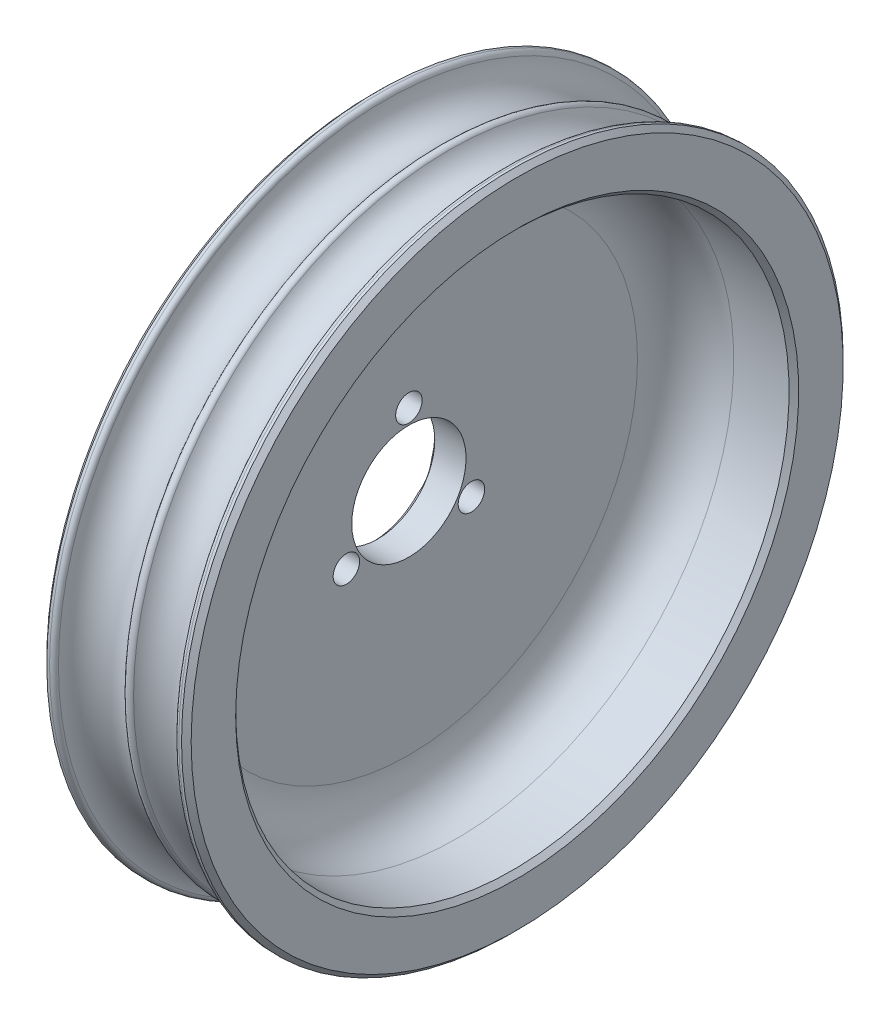
ISO-10303-21;
HEADER;
FILE_DESCRIPTION(('STEP AP214'),'2;1');
FILE_NAME('part.step','',(''),(''),'','','');
FILE_SCHEMA(('AUTOMOTIVE_DESIGN { 1 0 10303 214 1 1 1 1 }'));
ENDSEC;
DATA;
#1=APPLICATION_CONTEXT('core data for automotive mechanical design processes');
#2=APPLICATION_PROTOCOL_DEFINITION('international standard','automotive_design',2000,#1);
#3=PRODUCT_CONTEXT('',#1,'mechanical');
#4=PRODUCT('Part','Part','',(#3));
#5=PRODUCT_RELATED_PRODUCT_CATEGORY('part','',(#4));
#6=PRODUCT_DEFINITION_FORMATION('','',#4);
#7=PRODUCT_DEFINITION_CONTEXT('part definition',#1,'design');
#8=PRODUCT_DEFINITION('design','',#6,#7);
#9=PRODUCT_DEFINITION_SHAPE('','',#8);
#10=(LENGTH_UNIT() NAMED_UNIT(*) SI_UNIT(.MILLI.,.METRE.));
#11=(NAMED_UNIT(*) PLANE_ANGLE_UNIT() SI_UNIT($,.RADIAN.));
#12=(NAMED_UNIT(*) SI_UNIT($,.STERADIAN.) SOLID_ANGLE_UNIT());
#13=UNCERTAINTY_MEASURE_WITH_UNIT(LENGTH_MEASURE(1.E-05),#10,'distance_accuracy_value','');
#14=(GEOMETRIC_REPRESENTATION_CONTEXT(3) GLOBAL_UNCERTAINTY_ASSIGNED_CONTEXT((#13)) GLOBAL_UNIT_ASSIGNED_CONTEXT((#10,
#11,#12)) REPRESENTATION_CONTEXT('',''));
#15=CARTESIAN_POINT('',(0.,0.,0.));
#16=DIRECTION('',(0.,0.,1.));
#17=DIRECTION('',(1.,0.,0.));
#18=AXIS2_PLACEMENT_3D('',#15,#16,#17);
#19=CARTESIAN_POINT('',(-16.5806488145554,0.,0.));
#20=DIRECTION('',(-1.,0.,0.));
#21=DIRECTION('',(0.,0.,1.));
#22=AXIS2_PLACEMENT_3D('',#19,#20,#21);
#23=CYLINDRICAL_SURFACE('',#22,23.);
#24=CARTESIAN_POINT('',(1.,0.,0.));
#25=DIRECTION('',(-1.,0.,0.));
#26=DIRECTION('',(0.,0.,1.));
#27=AXIS2_PLACEMENT_3D('',#24,#25,#26);
#28=CIRCLE('',#27,23.);
#29=CARTESIAN_POINT('',(1.,0.,23.));
#30=VERTEX_POINT('',#29);
#31=EDGE_CURVE('E11',#30,#30,#28,.T.);
#32=ORIENTED_EDGE('',*,*,#31,.T.);
#33=EDGE_LOOP('',(#32));
#34=FACE_BOUND('',#33,.T.);
#35=CARTESIAN_POINT('',(5.60000000000001,0.,0.));
#36=DIRECTION('',(-1.,0.,0.));
#37=DIRECTION('',(0.,0.,1.));
#38=AXIS2_PLACEMENT_3D('',#35,#36,#37);
#39=CIRCLE('',#38,23.);
#40=CARTESIAN_POINT('',(5.60000000000001,0.,23.));
#41=VERTEX_POINT('',#40);
#42=EDGE_CURVE('E226',#41,#41,#39,.F.);
#43=ORIENTED_EDGE('',*,*,#42,.T.);
#44=EDGE_LOOP('',(#43));
#45=FACE_BOUND('',#44,.T.);
#46=ADVANCED_FACE('F35',(#34,#45),#23,.F.);
#47=CARTESIAN_POINT('',(2.5,0.,0.));
#48=DIRECTION('',(-1.,0.,0.));
#49=DIRECTION('',(0.,0.,1.));
#50=AXIS2_PLACEMENT_3D('',#47,#48,#49);
#51=TOROIDAL_SURFACE('',#50,27.5,2.5);
#52=CARTESIAN_POINT('',(4.97610458902581,0.,0.));
#53=DIRECTION('',(-1.,0.,0.));
#54=DIRECTION('',(0.,0.,1.));
#55=AXIS2_PLACEMENT_3D('',#52,#53,#54);
#56=CIRCLE('',#55,27.155172413793);
#57=CARTESIAN_POINT('',(4.97610458902581,0.,27.155172413793));
#58=VERTEX_POINT('',#57);
#59=EDGE_CURVE('E238',#58,#58,#56,.T.);
#60=ORIENTED_EDGE('',*,*,#59,.T.);
#61=EDGE_LOOP('',(#60));
#62=FACE_BOUND('',#61,.T.);
#63=CARTESIAN_POINT('',(0.344827586206885,0.,0.));
#64=DIRECTION('',(1.,0.,0.));
#65=DIRECTION('',(0.,0.,-1.));
#66=AXIS2_PLACEMENT_3D('',#63,#64,#65);
#67=CIRCLE('',#66,26.2330225468363);
#68=CARTESIAN_POINT('',(0.344827586206885,0.,-26.2330225468363));
#69=VERTEX_POINT('',#68);
#70=EDGE_CURVE('E241',#69,#69,#67,.T.);
#71=ORIENTED_EDGE('',*,*,#70,.T.);
#72=EDGE_LOOP('',(#71));
#73=FACE_BOUND('',#72,.T.);
#74=ADVANCED_FACE('F141',(#62,#73),#51,.F.);
#75=CARTESIAN_POINT('',(-2.5,0.,0.));
#76=DIRECTION('',(-1.,0.,0.));
#77=DIRECTION('',(0.,0.,1.));
#78=AXIS2_PLACEMENT_3D('',#75,#76,#77);
#79=TOROIDAL_SURFACE('',#78,27.5,2.5);
#80=CARTESIAN_POINT('',(-4.97610458902581,0.,0.));
#81=DIRECTION('',(1.,0.,0.));
#82=DIRECTION('',(0.,0.,-1.));
#83=AXIS2_PLACEMENT_3D('',#80,#81,#82);
#84=CIRCLE('',#83,27.155172413793);
#85=CARTESIAN_POINT('',(-4.97610458902581,0.,-27.155172413793));
#86=VERTEX_POINT('',#85);
#87=EDGE_CURVE('E244',#86,#86,#84,.T.);
#88=ORIENTED_EDGE('',*,*,#87,.T.);
#89=EDGE_LOOP('',(#88));
#90=FACE_BOUND('',#89,.T.);
#91=CARTESIAN_POINT('',(-0.344827586206884,0.,0.));
#92=DIRECTION('',(-1.,0.,0.));
#93=DIRECTION('',(0.,0.,1.));
#94=AXIS2_PLACEMENT_3D('',#91,#92,#93);
#95=CIRCLE('',#94,26.2330225468363);
#96=CARTESIAN_POINT('',(-0.344827586206884,0.,26.2330225468363));
#97=VERTEX_POINT('',#96);
#98=EDGE_CURVE('E247',#97,#97,#95,.T.);
#99=ORIENTED_EDGE('',*,*,#98,.T.);
#100=EDGE_LOOP('',(#99));
#101=FACE_BOUND('',#100,.T.);
#102=ADVANCED_FACE('F147',(#90,#101),#79,.F.);
#103=CARTESIAN_POINT('',(-16.5806488145554,0.,0.));
#104=DIRECTION('',(-1.,0.,0.));
#105=DIRECTION('',(0.,0.,1.));
#106=AXIS2_PLACEMENT_3D('',#103,#104,#105);
#107=CYLINDRICAL_SURFACE('',#106,27.5);
#108=CARTESIAN_POINT('',(-5.60000000000001,0.,0.));
#109=DIRECTION('',(1.,0.,0.));
#110=DIRECTION('',(0.,0.,-1.));
#111=AXIS2_PLACEMENT_3D('',#108,#109,#110);
#112=CIRCLE('',#111,27.5);
#113=CARTESIAN_POINT('',(-5.60000000000001,0.,-27.5));
#114=VERTEX_POINT('',#113);
#115=EDGE_CURVE('E202',#114,#114,#112,.T.);
#116=ORIENTED_EDGE('',*,*,#115,.T.);
#117=EDGE_LOOP('',(#116));
#118=FACE_BOUND('',#117,.T.);
#119=CARTESIAN_POINT('',(-5.37228132326901,0.,0.));
#120=DIRECTION('',(1.,0.,0.));
#121=DIRECTION('',(0.,0.,-1.));
#122=AXIS2_PLACEMENT_3D('',#119,#120,#121);
#123=CIRCLE('',#122,27.5);
#124=CARTESIAN_POINT('',(-5.37228132326901,0.,-27.5));
#125=VERTEX_POINT('',#124);
#126=EDGE_CURVE('E250',#125,#125,#123,.F.);
#127=ORIENTED_EDGE('',*,*,#126,.T.);
#128=EDGE_LOOP('',(#127));
#129=FACE_BOUND('',#128,.T.);
#130=ADVANCED_FACE('F157',(#118,#129),#107,.T.);
#131=CARTESIAN_POINT('',(-6.,27.5,0.));
#132=DIRECTION('',(1.,0.,0.));
#133=DIRECTION('',(0.,0.,-1.));
#134=AXIS2_PLACEMENT_3D('',#131,#132,#133);
#135=PLANE('',#134);
#136=CARTESIAN_POINT('',(-6.,6.,-2.53269627492614E-13));
#137=DIRECTION('',(1.,0.,0.));
#138=DIRECTION('',(0.,0.,-1.));
#139=AXIS2_PLACEMENT_3D('',#136,#137,#138);
#140=CIRCLE('',#139,1.49999999999999);
#141=CARTESIAN_POINT('',(-6.,5.02270833333327,-1.13793716797736));
#142=VERTEX_POINT('',#141);
#143=CARTESIAN_POINT('',(-6.,5.02270833333337,1.13793716797694));
#144=VERTEX_POINT('',#143);
#145=EDGE_CURVE('E50',#142,#144,#140,.T.);
#146=ORIENTED_EDGE('',*,*,#145,.T.);
#147=CARTESIAN_POINT('',(-6.,0.,0.));
#148=DIRECTION('',(1.,0.,0.));
#149=DIRECTION('',(0.,0.,-1.));
#150=AXIS2_PLACEMENT_3D('',#147,#148,#149);
#151=CIRCLE('',#150,5.14999999999999);
#152=CARTESIAN_POINT('',(-6.,-1.52587167128771,4.9187615964551));
#153=VERTEX_POINT('',#152);
#154=EDGE_CURVE('E55',#144,#153,#151,.T.);
#155=ORIENTED_EDGE('',*,*,#154,.T.);
#156=CARTESIAN_POINT('',(-6.,-2.99999999999978,5.19615242270676));
#157=DIRECTION('',(1.,0.,0.));
#158=DIRECTION('',(0.,0.,-1.));
#159=AXIS2_PLACEMENT_3D('',#156,#157,#158);
#160=CIRCLE('',#159,1.50000000000001);
#161=CARTESIAN_POINT('',(-6.,-3.49683666204524,3.78082442847802));
#162=VERTEX_POINT('',#161);
#163=EDGE_CURVE('E74',#153,#162,#160,.T.);
#164=ORIENTED_EDGE('',*,*,#163,.T.);
#165=CARTESIAN_POINT('',(-6.,0.,0.));
#166=DIRECTION('',(1.,0.,0.));
#167=DIRECTION('',(0.,0.,-1.));
#168=AXIS2_PLACEMENT_3D('',#165,#166,#167);
#169=CIRCLE('',#168,5.14999999999999);
#170=CARTESIAN_POINT('',(-6.,-3.49683666204556,-3.78082442847773));
#171=VERTEX_POINT('',#170);
#172=EDGE_CURVE('E68',#162,#171,#169,.T.);
#173=ORIENTED_EDGE('',*,*,#172,.T.);
#174=CARTESIAN_POINT('',(-6.,-3.00000000000022,-5.1961524227065));
#175=DIRECTION('',(1.,0.,0.));
#176=DIRECTION('',(0.,0.,-1.));
#177=AXIS2_PLACEMENT_3D('',#174,#175,#176);
#178=CIRCLE('',#177,1.49999999999999);
#179=CARTESIAN_POINT('',(-6.,-1.52587167128814,-4.91876159645497));
#180=VERTEX_POINT('',#179);
#181=EDGE_CURVE('E72',#171,#180,#178,.T.);
#182=ORIENTED_EDGE('',*,*,#181,.T.);
#183=CARTESIAN_POINT('',(-6.,0.,0.));
#184=DIRECTION('',(1.,0.,0.));
#185=DIRECTION('',(0.,0.,-1.));
#186=AXIS2_PLACEMENT_3D('',#183,#184,#185);
#187=CIRCLE('',#186,5.14999999999999);
#188=EDGE_CURVE('E79',#180,#142,#187,.T.);
#189=ORIENTED_EDGE('',*,*,#188,.T.);
#190=EDGE_LOOP('',(#146,#155,#164,#173,#182,#189));
#191=FACE_BOUND('',#190,.T.);
#192=CARTESIAN_POINT('',(-6.,0.,0.));
#193=DIRECTION('',(1.,0.,0.));
#194=DIRECTION('',(0.,0.,-1.));
#195=AXIS2_PLACEMENT_3D('',#192,#193,#194);
#196=CIRCLE('',#195,27.1);
#197=CARTESIAN_POINT('',(-6.,0.,-27.1));
#198=VERTEX_POINT('',#197);
#199=EDGE_CURVE('E85',#198,#198,#196,.F.);
#200=ORIENTED_EDGE('',*,*,#199,.T.);
#201=EDGE_LOOP('',(#200));
#202=FACE_BOUND('',#201,.T.);
#203=ADVANCED_FACE('F70',(#191,#202),#135,.F.);
#204=CARTESIAN_POINT('',(6.,27.5,0.));
#205=DIRECTION('',(-1.,0.,0.));
#206=DIRECTION('',(0.,0.,1.));
#207=AXIS2_PLACEMENT_3D('',#204,#205,#206);
#208=PLANE('',#207);
#209=CARTESIAN_POINT('',(6.,0.,0.));
#210=DIRECTION('',(-1.,0.,0.));
#211=DIRECTION('',(0.,0.,1.));
#212=AXIS2_PLACEMENT_3D('',#209,#210,#211);
#213=CIRCLE('',#212,23.4);
#214=CARTESIAN_POINT('',(6.,0.,23.4));
#215=VERTEX_POINT('',#214);
#216=EDGE_CURVE('E229',#215,#215,#213,.T.);
#217=ORIENTED_EDGE('',*,*,#216,.T.);
#218=EDGE_LOOP('',(#217));
#219=FACE_BOUND('',#218,.T.);
#220=CARTESIAN_POINT('',(6.,0.,0.));
#221=DIRECTION('',(-1.,0.,0.));
#222=DIRECTION('',(0.,0.,1.));
#223=AXIS2_PLACEMENT_3D('',#220,#221,#222);
#224=CIRCLE('',#223,27.1);
#225=CARTESIAN_POINT('',(6.,0.,27.1));
#226=VERTEX_POINT('',#225);
#227=EDGE_CURVE('E232',#226,#226,#224,.F.);
#228=ORIENTED_EDGE('',*,*,#227,.T.);
#229=EDGE_LOOP('',(#228));
#230=FACE_BOUND('',#229,.T.);
#231=ADVANCED_FACE('F153',(#219,#230),#208,.F.);
#232=CARTESIAN_POINT('',(-16.5806488145554,0.,0.));
#233=DIRECTION('',(-1.,0.,0.));
#234=DIRECTION('',(0.,0.,1.));
#235=AXIS2_PLACEMENT_3D('',#232,#233,#234);
#236=CYLINDRICAL_SURFACE('',#235,27.5);
#237=CARTESIAN_POINT('',(5.60000000000001,0.,0.));
#238=DIRECTION('',(-1.,0.,0.));
#239=DIRECTION('',(0.,0.,1.));
#240=AXIS2_PLACEMENT_3D('',#237,#238,#239);
#241=CIRCLE('',#240,27.5);
#242=CARTESIAN_POINT('',(5.60000000000002,0.,27.5));
#243=VERTEX_POINT('',#242);
#244=EDGE_CURVE('E223',#243,#243,#241,.T.);
#245=ORIENTED_EDGE('',*,*,#244,.T.);
#246=EDGE_LOOP('',(#245));
#247=FACE_BOUND('',#246,.T.);
#248=CARTESIAN_POINT('',(5.37228132326902,0.,0.));
#249=DIRECTION('',(1.,0.,0.));
#250=DIRECTION('',(0.,0.,-1.));
#251=AXIS2_PLACEMENT_3D('',#248,#249,#250);
#252=CIRCLE('',#251,27.5);
#253=CARTESIAN_POINT('',(5.37228132326902,0.,-27.5));
#254=VERTEX_POINT('',#253);
#255=EDGE_CURVE('E235',#254,#254,#252,.T.);
#256=ORIENTED_EDGE('',*,*,#255,.T.);
#257=EDGE_LOOP('',(#256));
#258=FACE_BOUND('',#257,.T.);
#259=ADVANCED_FACE('F168',(#247,#258),#236,.T.);
#260=CARTESIAN_POINT('',(-5.37228132326901,0.,0.));
#261=DIRECTION('',(1.,0.,0.));
#262=DIRECTION('',(0.,0.,-1.));
#263=AXIS2_PLACEMENT_3D('',#260,#261,#262);
#264=TOROIDAL_SURFACE('',#263,27.1,0.4);
#265=ORIENTED_EDGE('',*,*,#87,.F.);
#266=EDGE_LOOP('',(#265));
#267=FACE_BOUND('',#266,.T.);
#268=ORIENTED_EDGE('',*,*,#126,.F.);
#269=EDGE_LOOP('',(#268));
#270=FACE_BOUND('',#269,.T.);
#271=ADVANCED_FACE('F164',(#267,#270),#264,.T.);
#272=CARTESIAN_POINT('',(5.37228132326901,0.,0.));
#273=DIRECTION('',(1.,0.,0.));
#274=DIRECTION('',(0.,0.,-1.));
#275=AXIS2_PLACEMENT_3D('',#272,#273,#274);
#276=TOROIDAL_SURFACE('',#275,27.1,0.4);
#277=ORIENTED_EDGE('',*,*,#255,.F.);
#278=EDGE_LOOP('',(#277));
#279=FACE_BOUND('',#278,.T.);
#280=ORIENTED_EDGE('',*,*,#59,.F.);
#281=EDGE_LOOP('',(#280));
#282=FACE_BOUND('',#281,.T.);
#283=ADVANCED_FACE('F167',(#279,#282),#276,.T.);
#284=CARTESIAN_POINT('',(0.,0.,0.));
#285=DIRECTION('',(1.,0.,0.));
#286=DIRECTION('',(0.,0.,-1.));
#287=AXIS2_PLACEMENT_3D('',#284,#285,#286);
#288=TOROIDAL_SURFACE('',#287,26.0303061543301,0.4);
#289=ORIENTED_EDGE('',*,*,#70,.F.);
#290=EDGE_LOOP('',(#289));
#291=FACE_BOUND('',#290,.T.);
#292=ORIENTED_EDGE('',*,*,#98,.F.);
#293=EDGE_LOOP('',(#292));
#294=FACE_BOUND('',#293,.T.);
#295=ADVANCED_FACE('F172',(#291,#294),#288,.T.);
#296=CARTESIAN_POINT('',(-3.,0.,0.));
#297=DIRECTION('',(-1.,0.,0.));
#298=DIRECTION('',(0.,0.,1.));
#299=AXIS2_PLACEMENT_3D('',#296,#297,#298);
#300=PLANE('',#299);
#301=CARTESIAN_POINT('',(-3.,0.,0.));
#302=DIRECTION('',(-1.,0.,0.));
#303=DIRECTION('',(0.,0.,1.));
#304=AXIS2_PLACEMENT_3D('',#301,#302,#303);
#305=CIRCLE('',#304,19.);
#306=CARTESIAN_POINT('',(-3.,0.,19.));
#307=VERTEX_POINT('',#306);
#308=EDGE_CURVE('E43',#307,#307,#305,.F.);
#309=ORIENTED_EDGE('',*,*,#308,.T.);
#310=EDGE_LOOP('',(#309));
#311=FACE_BOUND('',#310,.T.);
#312=CARTESIAN_POINT('',(-3.,-3.00000000000022,-5.1961524227065));
#313=DIRECTION('',(-1.,0.,0.));
#314=DIRECTION('',(0.,0.,1.));
#315=AXIS2_PLACEMENT_3D('',#312,#313,#314);
#316=CIRCLE('',#315,1.1);
#317=CARTESIAN_POINT('',(-3.,-3.00000000000022,-4.0961524227065));
#318=VERTEX_POINT('',#317);
#319=EDGE_CURVE('E89',#318,#318,#316,.T.);
#320=ORIENTED_EDGE('',*,*,#319,.T.);
#321=EDGE_LOOP('',(#320));
#322=FACE_BOUND('',#321,.T.);
#323=CARTESIAN_POINT('',(-3.,-2.99999999999978,5.19615242270676));
#324=DIRECTION('',(-1.,0.,0.));
#325=DIRECTION('',(0.,0.,1.));
#326=AXIS2_PLACEMENT_3D('',#323,#324,#325);
#327=CIRCLE('',#326,1.1);
#328=CARTESIAN_POINT('',(-3.,-2.99999999999978,6.29615242270676));
#329=VERTEX_POINT('',#328);
#330=EDGE_CURVE('E93',#329,#329,#327,.T.);
#331=ORIENTED_EDGE('',*,*,#330,.T.);
#332=EDGE_LOOP('',(#331));
#333=FACE_BOUND('',#332,.T.);
#334=CARTESIAN_POINT('',(-3.,6.,-2.53269627492614E-13));
#335=DIRECTION('',(-1.,0.,0.));
#336=DIRECTION('',(0.,0.,1.));
#337=AXIS2_PLACEMENT_3D('',#334,#335,#336);
#338=CIRCLE('',#337,1.1);
#339=CARTESIAN_POINT('',(-3.,6.,1.09999999999975));
#340=VERTEX_POINT('',#339);
#341=EDGE_CURVE('E256',#340,#340,#338,.T.);
#342=ORIENTED_EDGE('',*,*,#341,.T.);
#343=EDGE_LOOP('',(#342));
#344=FACE_BOUND('',#343,.T.);
#345=CARTESIAN_POINT('',(-3.,0.,0.));
#346=DIRECTION('',(-1.,0.,0.));
#347=DIRECTION('',(0.,0.,1.));
#348=AXIS2_PLACEMENT_3D('',#345,#346,#347);
#349=CIRCLE('',#348,4.75);
#350=CARTESIAN_POINT('',(-3.,0.,4.75));
#351=VERTEX_POINT('',#350);
#352=EDGE_CURVE('E253',#351,#351,#349,.T.);
#353=ORIENTED_EDGE('',*,*,#352,.T.);
#354=EDGE_LOOP('',(#353));
#355=FACE_BOUND('',#354,.T.);
#356=ADVANCED_FACE('F176',(#311,#322,#333,#344,#355),#300,.F.);
#357=CARTESIAN_POINT('',(-3.,0.,0.));
#358=DIRECTION('',(-1.,0.,0.));
#359=DIRECTION('',(0.,0.,1.));
#360=AXIS2_PLACEMENT_3D('',#357,#358,#359);
#361=CYLINDRICAL_SURFACE('',#360,4.75);
#362=CARTESIAN_POINT('',(-5.60000000000001,0.,0.));
#363=DIRECTION('',(1.,0.,0.));
#364=DIRECTION('',(0.,0.,-1.));
#365=AXIS2_PLACEMENT_3D('',#362,#363,#364);
#366=CIRCLE('',#365,4.75);
#367=CARTESIAN_POINT('',(-5.60000000000001,0.,-4.75));
#368=VERTEX_POINT('',#367);
#369=EDGE_CURVE('E220',#368,#368,#366,.F.);
#370=ORIENTED_EDGE('',*,*,#369,.T.);
#371=EDGE_LOOP('',(#370));
#372=FACE_BOUND('',#371,.T.);
#373=ORIENTED_EDGE('',*,*,#352,.F.);
#374=EDGE_LOOP('',(#373));
#375=FACE_BOUND('',#374,.T.);
#376=ADVANCED_FACE('F275',(#372,#375),#361,.F.);
#377=CARTESIAN_POINT('',(-3.,6.,-2.53269627492614E-13));
#378=DIRECTION('',(-1.,0.,0.));
#379=DIRECTION('',(0.,0.,1.));
#380=AXIS2_PLACEMENT_3D('',#377,#378,#379);
#381=CYLINDRICAL_SURFACE('',#380,1.1);
#382=CARTESIAN_POINT('',(-5.60000000000001,6.,-2.53269627492614E-13));
#383=DIRECTION('',(1.,0.,0.));
#384=DIRECTION('',(0.,0.,-1.));
#385=AXIS2_PLACEMENT_3D('',#382,#383,#384);
#386=CIRCLE('',#385,1.1);
#387=CARTESIAN_POINT('',(-5.60000000000001,6.,-1.10000000000025));
#388=VERTEX_POINT('',#387);
#389=EDGE_CURVE('E211',#388,#388,#386,.F.);
#390=ORIENTED_EDGE('',*,*,#389,.T.);
#391=EDGE_LOOP('',(#390));
#392=FACE_BOUND('',#391,.T.);
#393=ORIENTED_EDGE('',*,*,#341,.F.);
#394=EDGE_LOOP('',(#393));
#395=FACE_BOUND('',#394,.T.);
#396=ADVANCED_FACE('F266',(#392,#395),#381,.F.);
#397=CARTESIAN_POINT('',(-3.,-2.99999999999978,5.19615242270676));
#398=DIRECTION('',(-1.,0.,0.));
#399=DIRECTION('',(0.,0.,1.));
#400=AXIS2_PLACEMENT_3D('',#397,#398,#399);
#401=CYLINDRICAL_SURFACE('',#400,1.1);
#402=CARTESIAN_POINT('',(-5.6,-2.99999999999978,5.19615242270676));
#403=DIRECTION('',(1.,0.,0.));
#404=DIRECTION('',(0.,0.,-1.));
#405=AXIS2_PLACEMENT_3D('',#402,#403,#404);
#406=CIRCLE('',#405,1.1);
#407=CARTESIAN_POINT('',(-5.6,-2.99999999999978,4.09615242270676));
#408=VERTEX_POINT('',#407);
#409=EDGE_CURVE('E208',#408,#408,#406,.F.);
#410=ORIENTED_EDGE('',*,*,#409,.T.);
#411=EDGE_LOOP('',(#410));
#412=FACE_BOUND('',#411,.T.);
#413=ORIENTED_EDGE('',*,*,#330,.F.);
#414=EDGE_LOOP('',(#413));
#415=FACE_BOUND('',#414,.T.);
#416=ADVANCED_FACE('F264',(#412,#415),#401,.F.);
#417=CARTESIAN_POINT('',(-3.,-3.00000000000022,-5.1961524227065));
#418=DIRECTION('',(-1.,0.,0.));
#419=DIRECTION('',(0.,0.,1.));
#420=AXIS2_PLACEMENT_3D('',#417,#418,#419);
#421=CYLINDRICAL_SURFACE('',#420,1.1);
#422=CARTESIAN_POINT('',(-5.60000000000001,-3.00000000000022,-5.1961524227065));
#423=DIRECTION('',(1.,0.,0.));
#424=DIRECTION('',(0.,0.,-1.));
#425=AXIS2_PLACEMENT_3D('',#422,#423,#424);
#426=CIRCLE('',#425,1.1);
#427=CARTESIAN_POINT('',(-5.60000000000001,-3.00000000000022,-6.2961524227065));
#428=VERTEX_POINT('',#427);
#429=EDGE_CURVE('E205',#428,#428,#426,.F.);
#430=ORIENTED_EDGE('',*,*,#429,.T.);
#431=EDGE_LOOP('',(#430));
#432=FACE_BOUND('',#431,.T.);
#433=ORIENTED_EDGE('',*,*,#319,.F.);
#434=EDGE_LOOP('',(#433));
#435=FACE_BOUND('',#434,.T.);
#436=ADVANCED_FACE('F184',(#432,#435),#421,.F.);
#437=CARTESIAN_POINT('',(6.,0.,0.));
#438=DIRECTION('',(1.,0.,0.));
#439=DIRECTION('',(0.,0.,-1.));
#440=AXIS2_PLACEMENT_3D('',#437,#438,#439);
#441=CONICAL_SURFACE('',#440,23.4,0.785398163397453);
#442=ORIENTED_EDGE('',*,*,#42,.F.);
#443=EDGE_LOOP('',(#442));
#444=FACE_BOUND('',#443,.T.);
#445=ORIENTED_EDGE('',*,*,#216,.F.);
#446=EDGE_LOOP('',(#445));
#447=FACE_BOUND('',#446,.T.);
#448=ADVANCED_FACE('F179',(#444,#447),#441,.F.);
#449=CARTESIAN_POINT('',(5.60000000000001,0.,0.));
#450=DIRECTION('',(-1.,0.,0.));
#451=DIRECTION('',(0.,0.,1.));
#452=AXIS2_PLACEMENT_3D('',#449,#450,#451);
#453=CONICAL_SURFACE('',#452,27.5,0.785398163397466);
#454=CARTESIAN_POINT('',(6.,0.,27.1));
#455=CARTESIAN_POINT('',(5.99583333333333,0.,27.1041666666667));
#456=CARTESIAN_POINT('',(5.99166666666667,0.,27.1083333333333));
#457=CARTESIAN_POINT('',(5.98333333333334,0.,27.1166666666667));
#458=CARTESIAN_POINT('',(5.97916666666667,0.,27.1208333333333));
#459=CARTESIAN_POINT('',(5.97083333333333,0.,27.1291666666667));
#460=CARTESIAN_POINT('',(5.96666666666667,0.,27.1333333333333));
#461=CARTESIAN_POINT('',(5.95833333333334,0.,27.1416666666667));
#462=CARTESIAN_POINT('',(5.95416666666667,0.,27.1458333333333));
#463=CARTESIAN_POINT('',(5.94583333333334,0.,27.1541666666667));
#464=CARTESIAN_POINT('',(5.94166666666667,0.,27.1583333333333));
#465=CARTESIAN_POINT('',(5.93333333333334,0.,27.1666666666667));
#466=CARTESIAN_POINT('',(5.92916666666667,0.,27.1708333333333));
#467=CARTESIAN_POINT('',(5.92083333333334,0.,27.1791666666667));
#468=CARTESIAN_POINT('',(5.91666666666667,0.,27.1833333333333));
#469=CARTESIAN_POINT('',(5.90833333333334,0.,27.1916666666667));
#470=CARTESIAN_POINT('',(5.90416666666667,0.,27.1958333333333));
#471=CARTESIAN_POINT('',(5.89583333333334,0.,27.2041666666667));
#472=CARTESIAN_POINT('',(5.89166666666667,0.,27.2083333333333));
#473=CARTESIAN_POINT('',(5.88333333333334,0.,27.2166666666667));
#474=CARTESIAN_POINT('',(5.87916666666667,0.,27.2208333333333));
#475=CARTESIAN_POINT('',(5.87083333333334,0.,27.2291666666667));
#476=CARTESIAN_POINT('',(5.86666666666667,0.,27.2333333333333));
#477=CARTESIAN_POINT('',(5.85833333333334,0.,27.2416666666667));
#478=CARTESIAN_POINT('',(5.85416666666667,0.,27.2458333333333));
#479=CARTESIAN_POINT('',(5.84583333333334,0.,27.2541666666667));
#480=CARTESIAN_POINT('',(5.84166666666667,0.,27.2583333333333));
#481=CARTESIAN_POINT('',(5.83333333333334,0.,27.2666666666667));
#482=CARTESIAN_POINT('',(5.82916666666667,0.,27.2708333333333));
#483=CARTESIAN_POINT('',(5.82083333333334,0.,27.2791666666667));
#484=CARTESIAN_POINT('',(5.81666666666667,0.,27.2833333333333));
#485=CARTESIAN_POINT('',(5.80833333333334,0.,27.2916666666667));
#486=CARTESIAN_POINT('',(5.80416666666667,0.,27.2958333333333));
#487=CARTESIAN_POINT('',(5.79583333333334,0.,27.3041666666667));
#488=CARTESIAN_POINT('',(5.79166666666668,0.,27.3083333333333));
#489=CARTESIAN_POINT('',(5.78333333333334,0.,27.3166666666667));
#490=CARTESIAN_POINT('',(5.77916666666668,0.,27.3208333333333));
#491=CARTESIAN_POINT('',(5.77083333333334,0.,27.3291666666667));
#492=CARTESIAN_POINT('',(5.76666666666668,0.,27.3333333333333));
#493=CARTESIAN_POINT('',(5.75833333333334,0.,27.3416666666667));
#494=CARTESIAN_POINT('',(5.75416666666668,0.,27.3458333333333));
#495=CARTESIAN_POINT('',(5.74583333333334,0.,27.3541666666667));
#496=CARTESIAN_POINT('',(5.74166666666668,0.,27.3583333333333));
#497=CARTESIAN_POINT('',(5.73333333333334,0.,27.3666666666667));
#498=CARTESIAN_POINT('',(5.72916666666668,0.,27.3708333333333));
#499=CARTESIAN_POINT('',(5.72083333333334,0.,27.3791666666667));
#500=CARTESIAN_POINT('',(5.71666666666668,0.,27.3833333333333));
#501=CARTESIAN_POINT('',(5.70833333333334,0.,27.3916666666667));
#502=CARTESIAN_POINT('',(5.70416666666668,0.,27.3958333333333));
#503=CARTESIAN_POINT('',(5.69583333333335,0.,27.4041666666667));
#504=CARTESIAN_POINT('',(5.69166666666668,0.,27.4083333333333));
#505=CARTESIAN_POINT('',(5.68333333333335,0.,27.4166666666667));
#506=CARTESIAN_POINT('',(5.67916666666668,0.,27.4208333333333));
#507=CARTESIAN_POINT('',(5.67083333333335,0.,27.4291666666667));
#508=CARTESIAN_POINT('',(5.66666666666668,0.,27.4333333333333));
#509=CARTESIAN_POINT('',(5.65833333333335,0.,27.4416666666667));
#510=CARTESIAN_POINT('',(5.65416666666668,0.,27.4458333333333));
#511=CARTESIAN_POINT('',(5.64583333333335,0.,27.4541666666667));
#512=CARTESIAN_POINT('',(5.64166666666668,0.,27.4583333333333));
#513=CARTESIAN_POINT('',(5.63333333333335,0.,27.4666666666667));
#514=CARTESIAN_POINT('',(5.62916666666668,0.,27.4708333333333));
#515=CARTESIAN_POINT('',(5.62083333333335,0.,27.4791666666667));
#516=CARTESIAN_POINT('',(5.61666666666668,0.,27.4833333333333));
#517=CARTESIAN_POINT('',(5.60833333333335,0.,27.4916666666667));
#518=CARTESIAN_POINT('',(5.60416666666668,0.,27.4958333333333));
#519=CARTESIAN_POINT('',(5.60000000000001,0.,27.5));
#520=B_SPLINE_CURVE_WITH_KNOTS('',3,(#454,#455,#456,#457,#458,#459,#460,#461,#462,#463,#464,
#465,#466,#467,#468,#469,#470,#471,#472,#473,#474,#475,#476,#477,#478,#479,#480,#481,#482,#483,
#484,#485,#486,#487,#488,#489,#490,#491,#492,#493,#494,#495,#496,#497,#498,#499,#500,#501,#502,
#503,#504,#505,#506,#507,#508,#509,#510,#511,#512,#513,#514,#515,#516,#517,#518,#519),
.UNSPECIFIED.,.F.,.F.,(4,2,2,2,2,2,2,2,2,2,2,2,2,2,2,2,2,2,2,2,2,2,2,2,2,2,2,2,2,2,2,2,4),(0.,
0.0176776695296648,0.0353553390593272,0.0530330085889895,0.0707106781186543,0.0883883476483167,
0.106066017177982,0.123743686707644,0.141421356237306,0.159099025766971,0.176776695296634,
0.194454364826296,0.212132034355961,0.229809703885623,0.247487373415288,0.265165042944951,
0.282842712474613,0.300520382004278,0.31819805153394,0.335875721063605,0.353553390593267,
0.37123106012293,0.388908729652595,0.406586399182257,0.424264068711922,0.441941738241585,
0.459619407771247,0.477297077300912,0.494974746830574,0.512652416360239,0.530330085889901,
0.548007755419563,0.565685424949229),.UNSPECIFIED.);
#521=EDGE_CURVE('BSEAM120',#226,#243,#520,.T.);
#522=ORIENTED_EDGE('',*,*,#227,.F.);
#523=ORIENTED_EDGE('',*,*,#244,.F.);
#524=ORIENTED_EDGE('',*,*,#521,.T.);
#525=ORIENTED_EDGE('',*,*,#521,.F.);
#526=EDGE_LOOP('',(#522,#524,#523,#525));
#527=FACE_BOUND('',#526,.T.);
#528=ADVANCED_FACE('F120',(#527),#453,.T.);
#529=CARTESIAN_POINT('',(-5.60000000000001,-3.00000000000022,-5.1961524227065));
#530=DIRECTION('',(-1.,0.,0.));
#531=DIRECTION('',(0.,0.,1.));
#532=AXIS2_PLACEMENT_3D('',#529,#530,#531);
#533=CONICAL_SURFACE('',#532,1.1,0.785398163397458);
#534=ORIENTED_EDGE('',*,*,#429,.F.);
#535=EDGE_LOOP('',(#534));
#536=FACE_BOUND('',#535,.T.);
#537=CARTESIAN_POINT('',(-6.0002,-1.52561374045294,-4.9190510014576));
#538=CARTESIAN_POINT('',(-5.96625952863562,-1.56942256785451,-4.86991672285521));
#539=CARTESIAN_POINT('',(-5.933857912259,-1.61478915958154,-4.82096402591505));
#540=CARTESIAN_POINT('',(-5.87306290480772,-1.70934584350954,-4.72366668191025));
#541=CARTESIAN_POINT('',(-5.84469264033007,-1.75855566967504,-4.67532688654688));
#542=CARTESIAN_POINT('',(-5.79310713325617,-1.86139798131537,-4.57971498067503));
#543=CARTESIAN_POINT('',(-5.76993006071655,-1.91505948026533,-4.53245293151316));
#544=CARTESIAN_POINT('',(-5.73043213032087,-2.02662176243028,-4.44029738001017));
#545=CARTESIAN_POINT('',(-5.71409530182964,-2.08451229595061,-4.39539857687512));
#546=CARTESIAN_POINT('',(-5.69392668791276,-2.18276706590329,-4.32450386075502));
#547=CARTESIAN_POINT('',(-5.68771036841671,-2.22193908112618,-4.29752127815509));
#548=CARTESIAN_POINT('',(-5.67881971097571,-2.30174862519235,-4.24519803794377));
#549=CARTESIAN_POINT('',(-5.6761443083612,-2.34238570974735,-4.21985688897281));
#550=CARTESIAN_POINT('',(-5.67445304613885,-2.42459930376148,-4.17120283330696));
#551=CARTESIAN_POINT('',(-5.67541522134848,-2.46616867269307,-4.14787861991408));
#552=CARTESIAN_POINT('',(-5.68090814000605,-2.55014422222717,-4.10325377505416));
#553=CARTESIAN_POINT('',(-5.6854387871601,-2.59255038021912,-4.08195308900037));
#554=CARTESIAN_POINT('',(-5.69785710624477,-2.67765263480195,-4.04154243846117));
#555=CARTESIAN_POINT('',(-5.70572861013796,-2.72034637290353,-4.02242247852959));
#556=CARTESIAN_POINT('',(-5.72454408497469,-2.80593054680276,-3.98622722855451));
#557=CARTESIAN_POINT('',(-5.73548938531319,-2.84882105979158,-3.96915282776902));
#558=CARTESIAN_POINT('',(-5.77254950972374,-2.97780047817912,-3.92071914517657));
#559=CARTESIAN_POINT('',(-5.80282987747326,-3.0638274479196,-3.89232167680428));
#560=CARTESIAN_POINT('',(-5.86106009002137,-3.20815387110521,-3.84989817206927));
#561=CARTESIAN_POINT('',(-5.88687433054691,-3.26686206581797,-3.83413600839336));
#562=CARTESIAN_POINT('',(-5.94147126941678,-3.38292746089494,-3.80547684977499));
#563=CARTESIAN_POINT('',(-5.9702251872004,-3.44029206256847,-3.79255536498723));
#564=CARTESIAN_POINT('',(-6.00020000000058,-3.49721625954852,-3.78074575632312));
#565=B_SPLINE_CURVE_WITH_KNOTS('',3,(#537,#538,#539,#540,#541,#542,#543,#544,#545,#546,#547,
#548,#549,#550,#551,#552,#553,#554,#555,#556,#557,#558,#559,#560,#561,#562,#563,#564),
.UNSPECIFIED.,.F.,.F.,(4,2,2,2,2,2,2,2,2,2,2,2,2,4),(0.,0.222302767404263,0.445833353980606,
0.670956607707862,0.895551271344732,1.03930045745122,1.18300641176754,1.3258460006994,
1.46868173529008,1.61083396144073,1.75304776234437,2.03869982182771,2.236706243528,
2.43293213667934),.UNSPECIFIED.);
#566=EDGE_CURVE('E83',#180,#171,#565,.T.);
#567=ORIENTED_EDGE('',*,*,#566,.F.);
#568=ORIENTED_EDGE('',*,*,#181,.F.);
#569=EDGE_LOOP('',(#567,#568));
#570=FACE_BOUND('',#569,.T.);
#571=ADVANCED_FACE('F82',(#536,#570),#533,.F.);
#572=CARTESIAN_POINT('',(-5.60000000000001,6.,-2.53269627492614E-13));
#573=DIRECTION('',(-1.,0.,0.));
#574=DIRECTION('',(0.,0.,1.));
#575=AXIS2_PLACEMENT_3D('',#572,#573,#574);
#576=CONICAL_SURFACE('',#575,1.1,0.785398163397458);
#577=ORIENTED_EDGE('',*,*,#389,.F.);
#578=EDGE_LOOP('',(#577));
#579=FACE_BOUND('',#578,.T.);
#580=CARTESIAN_POINT('',(-6.0002,5.02283000000004,1.13830524513396));
#581=CARTESIAN_POINT('',(-5.96625952863562,5.00218288023453,1.075798548393));
#582=CARTESIAN_POINT('',(-5.933857912259,4.98247189696411,1.01203357900419));
#583=CARTESIAN_POINT('',(-5.87306290480772,4.94548826729919,0.881496416622529));
#584=CARTESIAN_POINT('',(-5.84469264033007,4.92822968958353,0.814709559365702));
#585=CARTESIAN_POINT('',(-5.79310713325617,4.89684850601442,0.677839551965336));
#586=CARTESIAN_POINT('',(-5.76993006071655,4.88274912028032,0.607736306088585));
#587=CARTESIAN_POINT('',(-5.73043213032087,4.85872121266143,0.465042759878078));
#588=CARTESIAN_POINT('',(-5.71409530182964,4.84878297530713,0.392458685643314));
#589=CARTESIAN_POINT('',(-5.69392668791276,4.83651373512938,0.271920200761242));
#590=CARTESIAN_POINT('',(-5.68771036841671,4.83273214074957,0.22450494916083));
#591=CARTESIAN_POINT('',(-5.67881971097571,4.82732365755133,0.129226236429406));
#592=CARTESIAN_POINT('',(-5.6761443083612,4.8256961210589,0.0813629143835661));
#593=CARTESIAN_POINT('',(-5.67445304613885,4.8246672698622,-0.0141631744020141));
#594=CARTESIAN_POINT('',(-5.67541522134848,4.82525259300647,-0.061825410612501));
#595=CARTESIAN_POINT('',(-5.68090814000605,4.82859411848489,-0.156862792235745));
#596=CARTESIAN_POINT('',(-5.6854387871601,4.83135026224025,-0.204237945360572));
#597=CARTESIAN_POINT('',(-5.69785710624477,4.83890473958125,-0.298143985018237));
#598=CARTESIAN_POINT('',(-5.70572861013796,4.84369323761195,-0.344677826762508));
#599=CARTESIAN_POINT('',(-5.72454408497469,4.85513931858683,-0.43689352050869));
#600=CARTESIAN_POINT('',(-5.73548938531319,4.86179771024661,-0.482574994731097));
#601=CARTESIAN_POINT('',(-5.77254950972374,4.88434261991648,-0.61849128891628));
#602=CARTESIAN_POINT('',(-5.80282987747326,4.90276317577315,-0.70719156430827));
#603=CARTESIAN_POINT('',(-5.86106009002129,4.93818655454783,-0.853393665591667));
#604=CARTESIAN_POINT('',(-5.88687433054674,4.9538902177422,-0.912117535461012));
#605=CARTESIAN_POINT('',(-5.94147126941641,4.98710335586597,-1.02696269540677));
#606=CARTESIAN_POINT('',(-5.97022518719993,5.00459532262186,-1.08310264012774));
#607=CARTESIAN_POINT('',(-6.0002,5.02282999999994,-1.13830524513438));
#608=B_SPLINE_CURVE_WITH_KNOTS('',3,(#580,#581,#582,#583,#584,#585,#586,#587,#588,#589,#590,
#591,#592,#593,#594,#595,#596,#597,#598,#599,#600,#601,#602,#603,#604,#605,#606,#607),
.UNSPECIFIED.,.F.,.F.,(4,2,2,2,2,2,2,2,2,2,2,2,2,4),(0.,0.222302767404264,0.445833353980607,
0.670956607707863,0.895551271344732,1.03930045745122,1.18300641176754,1.3258460006994,
1.46868173529008,1.61083396144073,1.75304776234437,2.0386998218277,2.23670624352736,
2.43293213667808),.UNSPECIFIED.);
#609=EDGE_CURVE('E90',#144,#142,#608,.T.);
#610=ORIENTED_EDGE('',*,*,#609,.F.);
#611=ORIENTED_EDGE('',*,*,#145,.F.);
#612=EDGE_LOOP('',(#610,#611));
#613=FACE_BOUND('',#612,.T.);
#614=ADVANCED_FACE('F119',(#579,#613),#576,.F.);
#615=CARTESIAN_POINT('',(-5.6,-2.99999999999978,5.19615242270676));
#616=DIRECTION('',(-1.,0.,0.));
#617=DIRECTION('',(0.,0.,1.));
#618=AXIS2_PLACEMENT_3D('',#615,#616,#617);
#619=CONICAL_SURFACE('',#618,1.1,0.785398163397458);
#620=ORIENTED_EDGE('',*,*,#409,.F.);
#621=EDGE_LOOP('',(#620));
#622=FACE_BOUND('',#621,.T.);
#623=CARTESIAN_POINT('',(-6.00020000000058,-3.49721625954821,3.78074575632341));
#624=CARTESIAN_POINT('',(-5.96625952863616,-3.43276031238111,3.79411817446197));
#625=CARTESIAN_POINT('',(-5.93385791225951,-3.36768273738364,3.8089304469106));
#626=CARTESIAN_POINT('',(-5.87306290480817,-3.2361424237907,3.84217026528743));
#627=CARTESIAN_POINT('',(-5.84469264033048,-3.16967401990951,3.86061732718088));
#628=CARTESIAN_POINT('',(-5.79310713325651,-3.03545052470003,3.90187542870937));
#629=CARTESIAN_POINT('',(-5.76993006071685,-2.96768964001594,3.92471662542424));
#630=CARTESIAN_POINT('',(-5.73043213032109,-2.83209945023206,3.97525462013173));
#631=CARTESIAN_POINT('',(-5.71409530182983,-2.7642706793574,4.00293989123143));
#632=CARTESIAN_POINT('',(-5.69392668791288,-2.65374666922693,4.05258365999338));
#633=CARTESIAN_POINT('',(-5.68771036841682,-2.61079305962423,4.07301632899385));
#634=CARTESIAN_POINT('',(-5.67881971097577,-2.52557503235981,4.11597180151393));
#635=CARTESIAN_POINT('',(-5.67614430836123,-2.48331041131237,4.1384939745888));
#636=CARTESIAN_POINT('',(-5.67445304613884,-2.40006796610153,4.18536600770851));
#637=CARTESIAN_POINT('',(-5.67541522134844,-2.3590839203142,4.2097040305261));
#638=CARTESIAN_POINT('',(-5.68090814000597,-2.27844989625851,4.2601165672894));
#639=CARTESIAN_POINT('',(-5.68543878715999,-2.2387998820219,4.28619103436043));
#640=CARTESIAN_POINT('',(-5.69785710624462,-2.16125210478005,4.33968642347887));
#641=CARTESIAN_POINT('',(-5.70572861013779,-2.12334686470917,4.36710030529156));
#642=CARTESIAN_POINT('',(-5.72454408497448,-2.04920877178478,4.42312074906265));
#643=CARTESIAN_POINT('',(-5.73548938531297,-2.01297665045573,4.45172782249956));
#644=CARTESIAN_POINT('',(-5.77254950972346,-1.90654214173802,4.53921043409227));
#645=CARTESIAN_POINT('',(-5.80282987747295,-1.83893572785419,4.59951324111197));
#646=CARTESIAN_POINT('',(-5.861060090021,-1.7300326834433,4.7032918376605));
#647=CARTESIAN_POINT('',(-5.88687433054649,-1.68702815192499,4.74625354385408));
#648=CARTESIAN_POINT('',(-5.94147126941628,-1.60417589497196,4.83243954518175));
#649=CARTESIAN_POINT('',(-5.97022518719986,-1.56430326005439,4.87565800511508));
#650=CARTESIAN_POINT('',(-6.0002,-1.52561374045251,4.91905100145774));
#651=B_SPLINE_CURVE_WITH_KNOTS('',3,(#623,#624,#625,#626,#627,#628,#629,#630,#631,#632,#633,
#634,#635,#636,#637,#638,#639,#640,#641,#642,#643,#644,#645,#646,#647,#648,#649,#650),
.UNSPECIFIED.,.F.,.F.,(4,2,2,2,2,2,2,2,2,2,2,2,2,4),(0.,0.222302767404339,0.445833353980757,
0.670956607708105,0.895551271345064,1.03930045745155,1.18300641176788,1.32584600069974,
1.46868173529042,1.61083396144107,1.75304776234472,2.03869982182806,2.23670624352819,
2.43293213667936),.UNSPECIFIED.);
#652=EDGE_CURVE('E95',#162,#153,#651,.T.);
#653=ORIENTED_EDGE('',*,*,#652,.F.);
#654=ORIENTED_EDGE('',*,*,#163,.F.);
#655=EDGE_LOOP('',(#653,#654));
#656=FACE_BOUND('',#655,.T.);
#657=ADVANCED_FACE('F127',(#622,#656),#619,.F.);
#658=CARTESIAN_POINT('',(-5.60000000000001,0.,0.));
#659=DIRECTION('',(-1.,0.,0.));
#660=DIRECTION('',(0.,0.,1.));
#661=AXIS2_PLACEMENT_3D('',#658,#659,#660);
#662=CONICAL_SURFACE('',#661,4.75,0.785398163397451);
#663=ORIENTED_EDGE('',*,*,#188,.F.);
#664=ORIENTED_EDGE('',*,*,#566,.T.);
#665=ORIENTED_EDGE('',*,*,#172,.F.);
#666=ORIENTED_EDGE('',*,*,#652,.T.);
#667=ORIENTED_EDGE('',*,*,#154,.F.);
#668=ORIENTED_EDGE('',*,*,#609,.T.);
#669=EDGE_LOOP('',(#663,#664,#665,#666,#667,#668));
#670=FACE_BOUND('',#669,.T.);
#671=ORIENTED_EDGE('',*,*,#369,.F.);
#672=EDGE_LOOP('',(#671));
#673=FACE_BOUND('',#672,.T.);
#674=ADVANCED_FACE('F87',(#670,#673),#662,.F.);
#675=CARTESIAN_POINT('',(-6.,0.,0.));
#676=DIRECTION('',(1.,0.,0.));
#677=DIRECTION('',(0.,0.,-1.));
#678=AXIS2_PLACEMENT_3D('',#675,#676,#677);
#679=CONICAL_SURFACE('',#678,27.1,0.785398163397461);
#680=ORIENTED_EDGE('',*,*,#115,.F.);
#681=EDGE_LOOP('',(#680));
#682=FACE_BOUND('',#681,.T.);
#683=ORIENTED_EDGE('',*,*,#199,.F.);
#684=EDGE_LOOP('',(#683));
#685=FACE_BOUND('',#684,.T.);
#686=ADVANCED_FACE('F126',(#682,#685),#679,.T.);
#687=CARTESIAN_POINT('',(1.,0.,0.));
#688=DIRECTION('',(-1.,0.,0.));
#689=DIRECTION('',(0.,0.,1.));
#690=AXIS2_PLACEMENT_3D('',#687,#688,#689);
#691=TOROIDAL_SURFACE('',#690,19.,4.);
#692=ORIENTED_EDGE('',*,*,#31,.F.);
#693=EDGE_LOOP('',(#692));
#694=FACE_BOUND('',#693,.T.);
#695=ORIENTED_EDGE('',*,*,#308,.F.);
#696=EDGE_LOOP('',(#695));
#697=FACE_BOUND('',#696,.T.);
#698=ADVANCED_FACE('F37',(#694,#697),#691,.F.);
#699=CLOSED_SHELL('',(#46,#74,#102,#130,#203,#231,#259,#271,#283,#295,#356,#376,#396,#416,#436,
#448,#528,#571,#614,#657,#674,#686,#698));
#700=MANIFOLD_SOLID_BREP('B2',#699);
#701=ADVANCED_BREP_SHAPE_REPRESENTATION('',(#18,#700),#14);
#702=SHAPE_DEFINITION_REPRESENTATION(#9,#701);
ENDSEC;
END-ISO-10303-21;
